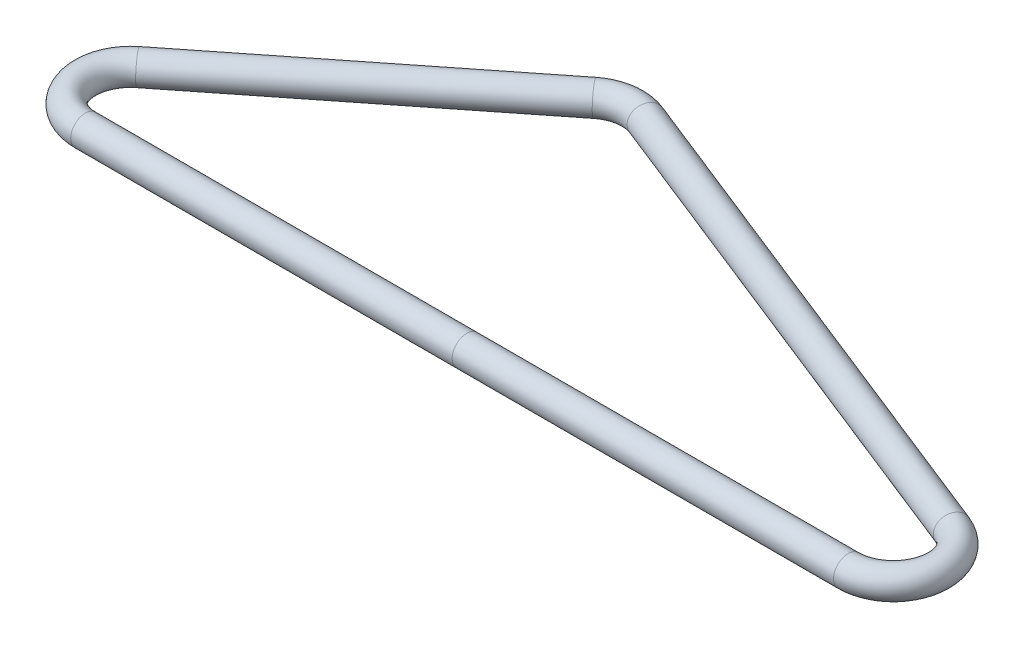
ISO-10303-21;
HEADER;
FILE_DESCRIPTION(('STEP AP214'),'2;1');
FILE_NAME('part.step','',(''),(''),'','','');
FILE_SCHEMA(('AUTOMOTIVE_DESIGN { 1 0 10303 214 1 1 1 1 }'));
ENDSEC;
DATA;
#1=APPLICATION_CONTEXT('core data for automotive mechanical design processes');
#2=APPLICATION_PROTOCOL_DEFINITION('international standard','automotive_design',2000,#1);
#3=PRODUCT_CONTEXT('',#1,'mechanical');
#4=PRODUCT('Part','Part','',(#3));
#5=PRODUCT_RELATED_PRODUCT_CATEGORY('part','',(#4));
#6=PRODUCT_DEFINITION_FORMATION('','',#4);
#7=PRODUCT_DEFINITION_CONTEXT('part definition',#1,'design');
#8=PRODUCT_DEFINITION('design','',#6,#7);
#9=PRODUCT_DEFINITION_SHAPE('','',#8);
#10=(LENGTH_UNIT() NAMED_UNIT(*) SI_UNIT(.MILLI.,.METRE.));
#11=(NAMED_UNIT(*) PLANE_ANGLE_UNIT() SI_UNIT($,.RADIAN.));
#12=(NAMED_UNIT(*) SI_UNIT($,.STERADIAN.) SOLID_ANGLE_UNIT());
#13=UNCERTAINTY_MEASURE_WITH_UNIT(LENGTH_MEASURE(1.E-05),#10,'distance_accuracy_value','');
#14=(GEOMETRIC_REPRESENTATION_CONTEXT(3) GLOBAL_UNCERTAINTY_ASSIGNED_CONTEXT((#13)) GLOBAL_UNIT_ASSIGNED_CONTEXT((#10,
#11,#12)) REPRESENTATION_CONTEXT('',''));
#15=CARTESIAN_POINT('',(0.,0.,0.));
#16=DIRECTION('',(0.,0.,1.));
#17=DIRECTION('',(1.,0.,0.));
#18=AXIS2_PLACEMENT_3D('',#15,#16,#17);
#19=CARTESIAN_POINT('',(-57.6174447189623,0.,-1.99276359302836E-13));
#20=DIRECTION('',(1.,0.,0.));
#21=DIRECTION('',(0.,0.,1.));
#22=AXIS2_PLACEMENT_3D('',#19,#20,#21);
#23=CYLINDRICAL_SURFACE('',#22,2.20345);
#24=CARTESIAN_POINT('',(0.,0.,0.));
#25=DIRECTION('',(-1.,0.,0.));
#26=DIRECTION('',(0.,0.,1.));
#27=AXIS2_PLACEMENT_3D('',#24,#25,#26);
#28=CIRCLE('',#27,2.20345);
#29=CARTESIAN_POINT('',(0.,0.,2.20345));
#30=VERTEX_POINT('',#29);
#31=EDGE_CURVE('E60',#30,#30,#28,.T.);
#32=ORIENTED_EDGE('',*,*,#31,.T.);
#33=EDGE_LOOP('',(#32));
#34=FACE_BOUND('',#33,.T.);
#35=CARTESIAN_POINT('',(-57.6174447189623,0.,-3.44283952949799E-13));
#36=DIRECTION('',(-1.,0.,0.));
#37=DIRECTION('',(0.,0.,1.));
#38=AXIS2_PLACEMENT_3D('',#35,#36,#37);
#39=CIRCLE('',#38,2.20345);
#40=CARTESIAN_POINT('',(-57.6174447189623,0.,2.20344999999965));
#41=VERTEX_POINT('',#40);
#42=EDGE_CURVE('E10',#41,#41,#39,.T.);
#43=ORIENTED_EDGE('',*,*,#42,.F.);
#44=EDGE_LOOP('',(#43));
#45=FACE_BOUND('',#44,.T.);
#46=ADVANCED_FACE('F35',(#34,#45),#23,.T.);
#47=CARTESIAN_POINT('',(-57.6174447189623,0.,-6.84418098503581));
#48=DIRECTION('',(0.,-1.,0.));
#49=DIRECTION('',(0.,0.,1.));
#50=AXIS2_PLACEMENT_3D('',#47,#48,#49);
#51=TOROIDAL_SURFACE('',#50,6.84418098503547,2.20345);
#52=CARTESIAN_POINT('',(-61.8634957084729,0.,-12.2120357101933));
#53=DIRECTION('',(0.784294678485898,0.,-0.620388472893156));
#54=DIRECTION('',(-0.620388472893156,0.,-0.784294678485898));
#55=AXIS2_PLACEMENT_3D('',#52,#53,#54);
#56=CIRCLE('',#55,2.20345);
#57=CARTESIAN_POINT('',(-63.2304906890694,0.,-13.9401898195031));
#58=VERTEX_POINT('',#57);
#59=EDGE_CURVE('E41',#58,#58,#56,.T.);
#60=CARTESIAN_POINT('',(-57.6174447189623,0.,-6.84418098503581));
#61=DIRECTION('',(0.,-1.,0.));
#62=DIRECTION('',(0.,0.,1.));
#63=AXIS2_PLACEMENT_3D('',#60,#61,#62);
#64=CIRCLE('',#63,9.04763098503547);
#65=EDGE_CURVE('',#41,#58,#64,.T.);
#66=ORIENTED_EDGE('',*,*,#42,.T.);
#67=ORIENTED_EDGE('',*,*,#59,.F.);
#68=ORIENTED_EDGE('',*,*,#65,.T.);
#69=ORIENTED_EDGE('',*,*,#65,.F.);
#70=EDGE_LOOP('',(#66,#68,#67,#69));
#71=FACE_BOUND('',#70,.T.);
#72=ADVANCED_FACE('F78',(#71),#51,.T.);
#73=CARTESIAN_POINT('',(-23.3521873975323,0.,-42.6750394861029));
#74=DIRECTION('',(-0.7842946784859,0.,0.620388472893153));
#75=DIRECTION('',(-0.620388472893153,0.,-0.7842946784859));
#76=AXIS2_PLACEMENT_3D('',#73,#74,#75);
#77=CYLINDRICAL_SURFACE('',#76,2.20345);
#78=ORIENTED_EDGE('',*,*,#59,.T.);
#79=EDGE_LOOP('',(#78));
#80=FACE_BOUND('',#79,.T.);
#81=CARTESIAN_POINT('',(-23.3521873975323,0.,-42.6750394861028));
#82=DIRECTION('',(0.784294678485873,0.,-0.620388472893187));
#83=DIRECTION('',(-0.620388472893187,0.,-0.784294678485873));
#84=AXIS2_PLACEMENT_3D('',#81,#82,#83);
#85=CIRCLE('',#84,2.20345);
#86=CARTESIAN_POINT('',(-24.7191823781288,0.,-44.4031935954125));
#87=VERTEX_POINT('',#86);
#88=EDGE_CURVE('E45',#87,#87,#85,.T.);
#89=ORIENTED_EDGE('',*,*,#88,.F.);
#90=EDGE_LOOP('',(#89));
#91=FACE_BOUND('',#90,.T.);
#92=ADVANCED_FACE('F82',(#80,#91),#77,.T.);
#93=CARTESIAN_POINT('',(-19.1061364080217,0.,-37.3071847609454));
#94=DIRECTION('',(0.,-1.,0.));
#95=DIRECTION('',(0.,0.,1.));
#96=AXIS2_PLACEMENT_3D('',#93,#94,#95);
#97=TOROIDAL_SURFACE('',#96,6.84418098503536,2.20345);
#98=CARTESIAN_POINT('',(-16.580463346966,0.,-43.6683001462042));
#99=DIRECTION('',(0.929419516983455,0.,0.369024879175159));
#100=DIRECTION('',(0.369024879175159,0.,-0.929419516983455));
#101=AXIS2_PLACEMENT_3D('',#98,#99,#100);
#102=CIRCLE('',#101,2.20345);
#103=CARTESIAN_POINT('',(-15.7673354769475,0.,-45.7162295809014));
#104=VERTEX_POINT('',#103);
#105=EDGE_CURVE('E49',#104,#104,#102,.T.);
#106=CARTESIAN_POINT('',(-19.1061364080217,0.,-37.3071847609454));
#107=DIRECTION('',(0.,-1.,0.));
#108=DIRECTION('',(0.,0.,1.));
#109=AXIS2_PLACEMENT_3D('',#106,#107,#108);
#110=CIRCLE('',#109,9.04763098503536);
#111=EDGE_CURVE('',#87,#104,#110,.T.);
#112=ORIENTED_EDGE('',*,*,#88,.T.);
#113=ORIENTED_EDGE('',*,*,#105,.F.);
#114=ORIENTED_EDGE('',*,*,#111,.T.);
#115=ORIENTED_EDGE('',*,*,#111,.F.);
#116=EDGE_LOOP('',(#112,#114,#113,#115));
#117=FACE_BOUND('',#116,.T.);
#118=ADVANCED_FACE('F86',(#117),#97,.T.);
#119=CARTESIAN_POINT('',(60.1431177800181,0.,-13.2052963702945));
#120=DIRECTION('',(-0.929419516983454,0.,-0.369024879175163));
#121=DIRECTION('',(0.369024879175163,0.,-0.929419516983454));
#122=AXIS2_PLACEMENT_3D('',#119,#120,#121);
#123=CYLINDRICAL_SURFACE('',#122,2.20345);
#124=ORIENTED_EDGE('',*,*,#105,.T.);
#125=EDGE_LOOP('',(#124));
#126=FACE_BOUND('',#125,.T.);
#127=CARTESIAN_POINT('',(60.1431177800181,0.,-13.2052963702945));
#128=DIRECTION('',(0.929419516983456,0.,0.369024879175157));
#129=DIRECTION('',(0.369024879175157,0.,-0.929419516983456));
#130=AXIS2_PLACEMENT_3D('',#127,#128,#129);
#131=CIRCLE('',#130,2.20345);
#132=CARTESIAN_POINT('',(60.9562456500366,0.,-15.2532258049917));
#133=VERTEX_POINT('',#132);
#134=EDGE_CURVE('E54',#133,#133,#131,.T.);
#135=ORIENTED_EDGE('',*,*,#134,.F.);
#136=EDGE_LOOP('',(#135));
#137=FACE_BOUND('',#136,.T.);
#138=ADVANCED_FACE('F74',(#126,#137),#123,.T.);
#139=CARTESIAN_POINT('',(57.6174447189623,0.,-6.8441809850354));
#140=DIRECTION('',(0.,-1.,0.));
#141=DIRECTION('',(0.,0.,1.));
#142=AXIS2_PLACEMENT_3D('',#139,#140,#141);
#143=TOROIDAL_SURFACE('',#142,6.84418098503559,2.20345);
#144=CARTESIAN_POINT('',(57.6174447189623,0.,1.99276359302836E-13));
#145=DIRECTION('',(-1.,0.,0.));
#146=DIRECTION('',(0.,0.,1.));
#147=AXIS2_PLACEMENT_3D('',#144,#145,#146);
#148=CIRCLE('',#147,2.20345);
#149=CARTESIAN_POINT('',(57.6174447189622,0.,2.20345000000019));
#150=VERTEX_POINT('',#149);
#151=EDGE_CURVE('E57',#150,#150,#148,.T.);
#152=CARTESIAN_POINT('',(57.6174447189623,0.,-6.8441809850354));
#153=DIRECTION('',(0.,-1.,0.));
#154=DIRECTION('',(0.,0.,1.));
#155=AXIS2_PLACEMENT_3D('',#152,#153,#154);
#156=CIRCLE('',#155,9.04763098503559);
#157=EDGE_CURVE('',#133,#150,#156,.T.);
#158=ORIENTED_EDGE('',*,*,#134,.T.);
#159=ORIENTED_EDGE('',*,*,#151,.F.);
#160=ORIENTED_EDGE('',*,*,#157,.T.);
#161=ORIENTED_EDGE('',*,*,#157,.F.);
#162=EDGE_LOOP('',(#158,#160,#159,#161));
#163=FACE_BOUND('',#162,.T.);
#164=ADVANCED_FACE('F68',(#163),#143,.T.);
#165=CARTESIAN_POINT('',(0.,0.,0.));
#166=DIRECTION('',(1.,0.,0.));
#167=DIRECTION('',(0.,0.,1.));
#168=AXIS2_PLACEMENT_3D('',#165,#166,#167);
#169=CYLINDRICAL_SURFACE('',#168,2.20345);
#170=CARTESIAN_POINT('',(57.6174447189623,0.,2.2034500000002));
#171=CARTESIAN_POINT('',(57.0172630031397,0.,2.2034500000002));
#172=CARTESIAN_POINT('',(56.4170812873172,0.,2.20345000000019));
#173=CARTESIAN_POINT('',(55.2167178556722,0.,2.20345000000019));
#174=CARTESIAN_POINT('',(54.6165361398497,0.,2.20345000000019));
#175=CARTESIAN_POINT('',(53.4161727082046,0.,2.20345000000018));
#176=CARTESIAN_POINT('',(52.8159909923821,0.,2.20345000000018));
#177=CARTESIAN_POINT('',(51.615627560737,0.,2.20345000000018));
#178=CARTESIAN_POINT('',(51.0154458449145,0.,2.20345000000018));
#179=CARTESIAN_POINT('',(49.8150824132695,0.,2.20345000000017));
#180=CARTESIAN_POINT('',(49.2149006974469,0.,2.20345000000017));
#181=CARTESIAN_POINT('',(48.0145372658019,0.,2.20345000000017));
#182=CARTESIAN_POINT('',(47.4143555499794,0.,2.20345000000016));
#183=CARTESIAN_POINT('',(46.2139921183343,0.,2.20345000000016));
#184=CARTESIAN_POINT('',(45.6138104025118,0.,2.20345000000016));
#185=CARTESIAN_POINT('',(44.4134469708668,0.,2.20345000000015));
#186=CARTESIAN_POINT('',(43.8132652550442,0.,2.20345000000015));
#187=CARTESIAN_POINT('',(42.6129018233992,0.,2.20345000000015));
#188=CARTESIAN_POINT('',(42.0127201075767,0.,2.20345000000014));
#189=CARTESIAN_POINT('',(40.8123566759316,0.,2.20345000000014));
#190=CARTESIAN_POINT('',(40.2121749601091,0.,2.20345000000014));
#191=CARTESIAN_POINT('',(39.011811528464,0.,2.20345000000013));
#192=CARTESIAN_POINT('',(38.4116298126415,0.,2.20345000000013));
#193=CARTESIAN_POINT('',(37.2112663809965,0.,2.20345000000013));
#194=CARTESIAN_POINT('',(36.6110846651739,0.,2.20345000000013));
#195=CARTESIAN_POINT('',(35.4107212335289,0.,2.20345000000012));
#196=CARTESIAN_POINT('',(34.8105395177064,0.,2.20345000000012));
#197=CARTESIAN_POINT('',(33.6101760860613,0.,2.20345000000012));
#198=CARTESIAN_POINT('',(33.0099943702388,0.,2.20345000000011));
#199=CARTESIAN_POINT('',(31.8096309385937,0.,2.20345000000011));
#200=CARTESIAN_POINT('',(31.2094492227712,0.,2.20345000000011));
#201=CARTESIAN_POINT('',(30.0090857911262,0.,2.2034500000001));
#202=CARTESIAN_POINT('',(29.4089040753037,0.,2.2034500000001));
#203=CARTESIAN_POINT('',(28.2085406436586,0.,2.2034500000001));
#204=CARTESIAN_POINT('',(27.6083589278361,0.,2.2034500000001));
#205=CARTESIAN_POINT('',(26.407995496191,0.,2.20345000000009));
#206=CARTESIAN_POINT('',(25.8078137803685,0.,2.20345000000009));
#207=CARTESIAN_POINT('',(24.6074503487235,0.,2.20345000000008));
#208=CARTESIAN_POINT('',(24.0072686329009,0.,2.20345000000008));
#209=CARTESIAN_POINT('',(22.8069052012559,0.,2.20345000000008));
#210=CARTESIAN_POINT('',(22.2067234854334,0.,2.20345000000008));
#211=CARTESIAN_POINT('',(21.0063600537883,0.,2.20345000000007));
#212=CARTESIAN_POINT('',(20.4061783379658,0.,2.20345000000007));
#213=CARTESIAN_POINT('',(19.2058149063208,0.,2.20345000000007));
#214=CARTESIAN_POINT('',(18.6056331904982,0.,2.20345000000006));
#215=CARTESIAN_POINT('',(17.4052697588532,0.,2.20345000000006));
#216=CARTESIAN_POINT('',(16.8050880430307,0.,2.20345000000006));
#217=CARTESIAN_POINT('',(15.6047246113856,0.,2.20345000000005));
#218=CARTESIAN_POINT('',(15.0045428955631,0.,2.20345000000005));
#219=CARTESIAN_POINT('',(13.804179463918,0.,2.20345000000005));
#220=CARTESIAN_POINT('',(13.2039977480955,0.,2.20345000000005));
#221=CARTESIAN_POINT('',(12.0036343164505,0.,2.20345000000004));
#222=CARTESIAN_POINT('',(11.403452600628,0.,2.20345000000004));
#223=CARTESIAN_POINT('',(10.2030891689829,0.,2.20345000000003));
#224=CARTESIAN_POINT('',(9.60290745316038,0.,2.20345000000003));
#225=CARTESIAN_POINT('',(8.40254402151533,0.,2.20345000000003));
#226=CARTESIAN_POINT('',(7.80236230569281,0.,2.20345000000003));
#227=CARTESIAN_POINT('',(6.60199887404776,0.,2.20345000000002));
#228=CARTESIAN_POINT('',(6.00181715822524,0.,2.20345000000002));
#229=CARTESIAN_POINT('',(4.80145372658019,0.,2.20345000000002));
#230=CARTESIAN_POINT('',(4.20127201075766,0.,2.20345000000001));
#231=CARTESIAN_POINT('',(3.00090857911262,0.,2.20345000000001));
#232=CARTESIAN_POINT('',(2.40072686329009,0.,2.20345000000001));
#233=CARTESIAN_POINT('',(1.20036343164505,0.,2.20345));
#234=CARTESIAN_POINT('',(0.600181715822525,0.,2.20345));
#235=CARTESIAN_POINT('',(0.,0.,2.20345));
#236=B_SPLINE_CURVE_WITH_KNOTS('',3,(#170,#171,#172,#173,#174,#175,#176,#177,#178,#179,#180,
#181,#182,#183,#184,#185,#186,#187,#188,#189,#190,#191,#192,#193,#194,#195,#196,#197,#198,#199,
#200,#201,#202,#203,#204,#205,#206,#207,#208,#209,#210,#211,#212,#213,#214,#215,#216,#217,#218,
#219,#220,#221,#222,#223,#224,#225,#226,#227,#228,#229,#230,#231,#232,#233,#234,#235),
.UNSPECIFIED.,.F.,.F.,(4,2,2,2,2,2,2,2,2,2,2,2,2,2,2,2,2,2,2,2,2,2,2,2,2,2,2,2,2,2,2,2,4),(0.,
1.80054514746757,3.60109029493514,5.40163544240271,7.20218058987029,9.00272573733785,
10.8032708848054,12.603816032273,14.4043611797406,16.2049063272081,18.0054514746757,
19.8059966221433,21.6065417696109,23.4070869170784,25.207632064546,27.0081772120136,
28.8087223594811,30.6092675069487,32.4098126544163,34.2103578018838,36.0109029493514,
37.811448096819,39.6119932442866,41.4125383917541,43.2130835392217,45.0136286866893,
46.8141738341568,48.6147189816244,50.415264129092,52.2158092765596,54.0163544240271,
55.8168995714947,57.6174447189623),.UNSPECIFIED.);
#237=EDGE_CURVE('BSEAM66',#150,#30,#236,.T.);
#238=ORIENTED_EDGE('',*,*,#151,.T.);
#239=ORIENTED_EDGE('',*,*,#31,.F.);
#240=ORIENTED_EDGE('',*,*,#237,.T.);
#241=ORIENTED_EDGE('',*,*,#237,.F.);
#242=EDGE_LOOP('',(#238,#240,#239,#241));
#243=FACE_BOUND('',#242,.T.);
#244=ADVANCED_FACE('F66',(#243),#169,.T.);
#245=CLOSED_SHELL('',(#46,#72,#92,#118,#138,#164,#244));
#246=MANIFOLD_SOLID_BREP('B2',#245);
#247=ADVANCED_BREP_SHAPE_REPRESENTATION('',(#18,#246),#14);
#248=SHAPE_DEFINITION_REPRESENTATION(#9,#247);
ENDSEC;
END-ISO-10303-21;
